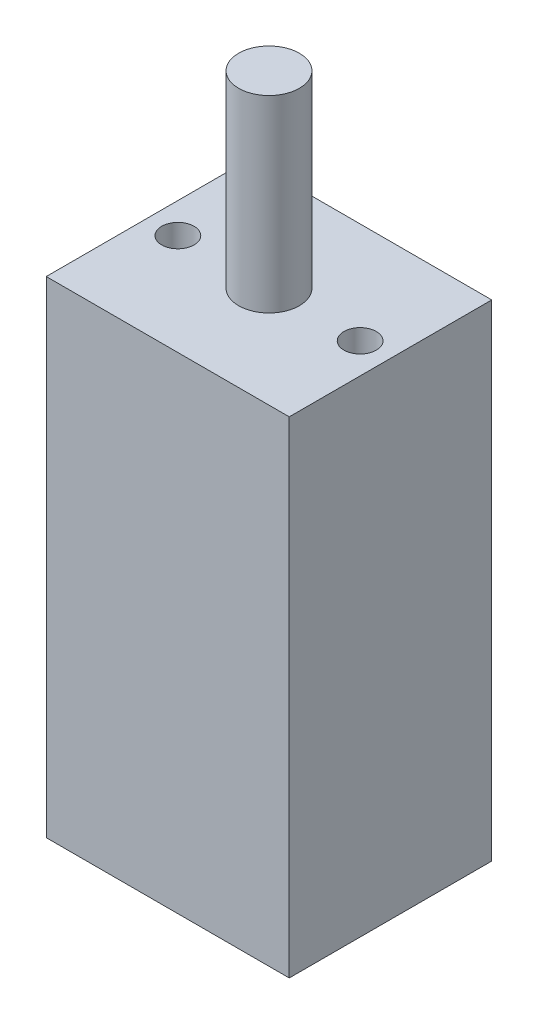
ISO-10303-21;
HEADER;
FILE_DESCRIPTION(('STEP AP214'),'2;1');
FILE_NAME('part.step','',(''),(''),'','','');
FILE_SCHEMA(('AUTOMOTIVE_DESIGN { 1 0 10303 214 1 1 1 1 }'));
ENDSEC;
DATA;
#1=APPLICATION_CONTEXT('core data for automotive mechanical design processes');
#2=APPLICATION_PROTOCOL_DEFINITION('international standard','automotive_design',2000,#1);
#3=PRODUCT_CONTEXT('',#1,'mechanical');
#4=PRODUCT('Part','Part','',(#3));
#5=PRODUCT_RELATED_PRODUCT_CATEGORY('part','',(#4));
#6=PRODUCT_DEFINITION_FORMATION('','',#4);
#7=PRODUCT_DEFINITION_CONTEXT('part definition',#1,'design');
#8=PRODUCT_DEFINITION('design','',#6,#7);
#9=PRODUCT_DEFINITION_SHAPE('','',#8);
#10=(LENGTH_UNIT() NAMED_UNIT(*) SI_UNIT(.MILLI.,.METRE.));
#11=(NAMED_UNIT(*) PLANE_ANGLE_UNIT() SI_UNIT($,.RADIAN.));
#12=(NAMED_UNIT(*) SI_UNIT($,.STERADIAN.) SOLID_ANGLE_UNIT());
#13=UNCERTAINTY_MEASURE_WITH_UNIT(LENGTH_MEASURE(1.E-05),#10,'distance_accuracy_value','');
#14=(GEOMETRIC_REPRESENTATION_CONTEXT(3) GLOBAL_UNCERTAINTY_ASSIGNED_CONTEXT((#13)) GLOBAL_UNIT_ASSIGNED_CONTEXT((#10,
#11,#12)) REPRESENTATION_CONTEXT('',''));
#15=CARTESIAN_POINT('',(0.,0.,0.));
#16=DIRECTION('',(0.,0.,1.));
#17=DIRECTION('',(1.,0.,0.));
#18=AXIS2_PLACEMENT_3D('',#15,#16,#17);
#19=CARTESIAN_POINT('',(0.,24.,0.));
#20=DIRECTION('',(0.,-1.,0.));
#21=DIRECTION('',(0.,0.,-1.));
#22=AXIS2_PLACEMENT_3D('',#19,#20,#21);
#23=PLANE('',#22);
#24=CARTESIAN_POINT('',(0.,24.,0.));
#25=DIRECTION('',(0.,-1.,0.));
#26=DIRECTION('',(0.,0.,-1.));
#27=AXIS2_PLACEMENT_3D('',#24,#25,#26);
#28=CIRCLE('',#27,1.5);
#29=CARTESIAN_POINT('',(0.,24.,-1.5));
#30=VERTEX_POINT('',#29);
#31=EDGE_CURVE('E11',#30,#30,#28,.F.);
#32=ORIENTED_EDGE('',*,*,#31,.F.);
#33=EDGE_LOOP('',(#32));
#34=FACE_BOUND('',#33,.T.);
#35=DIRECTION('',(0.,0.,-1.));
#36=VECTOR('',#35,1.);
#37=CARTESIAN_POINT('',(6.,24.,5.));
#38=LINE('',#37,#36);
#39=CARTESIAN_POINT('',(6.,24.,5.));
#40=VERTEX_POINT('',#39);
#41=CARTESIAN_POINT('',(6.,24.,-5.));
#42=VERTEX_POINT('',#41);
#43=EDGE_CURVE('E92',#40,#42,#38,.T.);
#44=ORIENTED_EDGE('',*,*,#43,.T.);
#45=DIRECTION('',(-1.,0.,0.));
#46=VECTOR('',#45,1.);
#47=CARTESIAN_POINT('',(-6.,24.,-5.));
#48=LINE('',#47,#46);
#49=CARTESIAN_POINT('',(-6.,24.,-5.));
#50=VERTEX_POINT('',#49);
#51=EDGE_CURVE('E87',#42,#50,#48,.T.);
#52=ORIENTED_EDGE('',*,*,#51,.T.);
#53=DIRECTION('',(0.,0.,1.));
#54=VECTOR('',#53,1.);
#55=CARTESIAN_POINT('',(-6.,24.,5.));
#56=LINE('',#55,#54);
#57=CARTESIAN_POINT('',(-6.,24.,5.));
#58=VERTEX_POINT('',#57);
#59=EDGE_CURVE('E95',#50,#58,#56,.T.);
#60=ORIENTED_EDGE('',*,*,#59,.T.);
#61=DIRECTION('',(1.,0.,0.));
#62=VECTOR('',#61,1.);
#63=CARTESIAN_POINT('',(-6.,24.,5.));
#64=LINE('',#63,#62);
#65=EDGE_CURVE('E59',#58,#40,#64,.T.);
#66=ORIENTED_EDGE('',*,*,#65,.T.);
#67=EDGE_LOOP('',(#44,#52,#60,#66));
#68=FACE_BOUND('',#67,.T.);
#69=CARTESIAN_POINT('',(4.5,24.,0.));
#70=DIRECTION('',(0.,1.,0.));
#71=DIRECTION('',(0.,0.,1.));
#72=AXIS2_PLACEMENT_3D('',#69,#70,#71);
#73=CIRCLE('',#72,0.800000000000001);
#74=CARTESIAN_POINT('',(4.5,24.,0.799999999999999));
#75=VERTEX_POINT('',#74);
#76=EDGE_CURVE('E112',#75,#75,#73,.T.);
#77=ORIENTED_EDGE('',*,*,#76,.F.);
#78=EDGE_LOOP('',(#77));
#79=FACE_BOUND('',#78,.T.);
#80=CARTESIAN_POINT('',(-4.5,24.,0.));
#81=DIRECTION('',(0.,1.,0.));
#82=DIRECTION('',(0.,0.,1.));
#83=AXIS2_PLACEMENT_3D('',#80,#81,#82);
#84=CIRCLE('',#83,0.8);
#85=CARTESIAN_POINT('',(-4.5,24.,0.8));
#86=VERTEX_POINT('',#85);
#87=EDGE_CURVE('E126',#86,#86,#84,.T.);
#88=ORIENTED_EDGE('',*,*,#87,.F.);
#89=EDGE_LOOP('',(#88));
#90=FACE_BOUND('',#89,.T.);
#91=ADVANCED_FACE('F41',(#34,#68,#79,#90),#23,.F.);
#92=CARTESIAN_POINT('',(0.,0.,0.));
#93=DIRECTION('',(0.,-1.,0.));
#94=DIRECTION('',(0.,0.,-1.));
#95=AXIS2_PLACEMENT_3D('',#92,#93,#94);
#96=PLANE('',#95);
#97=CARTESIAN_POINT('',(4.5,0.,0.));
#98=DIRECTION('',(0.,1.,0.));
#99=DIRECTION('',(0.,0.,1.));
#100=AXIS2_PLACEMENT_3D('',#97,#98,#99);
#101=CIRCLE('',#100,0.800000000000001);
#102=CARTESIAN_POINT('',(4.5,0.,0.799999999999999));
#103=VERTEX_POINT('',#102);
#104=EDGE_CURVE('E135',#103,#103,#101,.T.);
#105=ORIENTED_EDGE('',*,*,#104,.T.);
#106=EDGE_LOOP('',(#105));
#107=FACE_BOUND('',#106,.T.);
#108=DIRECTION('',(0.,0.,-1.));
#109=VECTOR('',#108,1.);
#110=CARTESIAN_POINT('',(6.,0.,5.));
#111=LINE('',#110,#109);
#112=CARTESIAN_POINT('',(6.,0.,5.));
#113=VERTEX_POINT('',#112);
#114=CARTESIAN_POINT('',(6.,0.,-5.));
#115=VERTEX_POINT('',#114);
#116=EDGE_CURVE('E106',#113,#115,#111,.T.);
#117=ORIENTED_EDGE('',*,*,#116,.F.);
#118=DIRECTION('',(1.,0.,0.));
#119=VECTOR('',#118,1.);
#120=CARTESIAN_POINT('',(-6.,0.,5.));
#121=LINE('',#120,#119);
#122=CARTESIAN_POINT('',(-6.,0.,5.));
#123=VERTEX_POINT('',#122);
#124=EDGE_CURVE('E83',#123,#113,#121,.T.);
#125=ORIENTED_EDGE('',*,*,#124,.F.);
#126=DIRECTION('',(0.,0.,1.));
#127=VECTOR('',#126,1.);
#128=CARTESIAN_POINT('',(-6.,0.,5.));
#129=LINE('',#128,#127);
#130=CARTESIAN_POINT('',(-6.,0.,-5.));
#131=VERTEX_POINT('',#130);
#132=EDGE_CURVE('E74',#131,#123,#129,.T.);
#133=ORIENTED_EDGE('',*,*,#132,.F.);
#134=DIRECTION('',(-1.,0.,0.));
#135=VECTOR('',#134,1.);
#136=CARTESIAN_POINT('',(-6.,0.,-5.));
#137=LINE('',#136,#135);
#138=EDGE_CURVE('E98',#115,#131,#137,.T.);
#139=ORIENTED_EDGE('',*,*,#138,.F.);
#140=EDGE_LOOP('',(#117,#125,#133,#139));
#141=FACE_BOUND('',#140,.T.);
#142=CARTESIAN_POINT('',(-4.5,0.,0.));
#143=DIRECTION('',(0.,1.,0.));
#144=DIRECTION('',(0.,0.,1.));
#145=AXIS2_PLACEMENT_3D('',#142,#143,#144);
#146=CIRCLE('',#145,0.8);
#147=CARTESIAN_POINT('',(-4.5,0.,0.8));
#148=VERTEX_POINT('',#147);
#149=EDGE_CURVE('E128',#148,#148,#146,.T.);
#150=ORIENTED_EDGE('',*,*,#149,.T.);
#151=EDGE_LOOP('',(#150));
#152=FACE_BOUND('',#151,.T.);
#153=ADVANCED_FACE('F117',(#107,#141,#152),#96,.T.);
#154=CARTESIAN_POINT('',(6.,24.,5.));
#155=DIRECTION('',(-1.,0.,0.));
#156=DIRECTION('',(0.,0.,1.));
#157=AXIS2_PLACEMENT_3D('',#154,#155,#156);
#158=PLANE('',#157);
#159=ORIENTED_EDGE('',*,*,#116,.T.);
#160=DIRECTION('',(0.,-1.,0.));
#161=VECTOR('',#160,1.);
#162=CARTESIAN_POINT('',(6.,24.,-5.));
#163=LINE('',#162,#161);
#164=EDGE_CURVE('E49',#42,#115,#163,.T.);
#165=ORIENTED_EDGE('',*,*,#164,.F.);
#166=ORIENTED_EDGE('',*,*,#43,.F.);
#167=DIRECTION('',(0.,-1.,0.));
#168=VECTOR('',#167,1.);
#169=CARTESIAN_POINT('',(6.,24.,5.));
#170=LINE('',#169,#168);
#171=EDGE_CURVE('E101',#40,#113,#170,.T.);
#172=ORIENTED_EDGE('',*,*,#171,.T.);
#173=EDGE_LOOP('',(#159,#165,#166,#172));
#174=FACE_BOUND('',#173,.T.);
#175=ADVANCED_FACE('F43',(#174),#158,.F.);
#176=CARTESIAN_POINT('',(-6.,24.,-5.));
#177=DIRECTION('',(0.,0.,1.));
#178=DIRECTION('',(1.,0.,0.));
#179=AXIS2_PLACEMENT_3D('',#176,#177,#178);
#180=PLANE('',#179);
#181=ORIENTED_EDGE('',*,*,#138,.T.);
#182=DIRECTION('',(0.,-1.,0.));
#183=VECTOR('',#182,1.);
#184=CARTESIAN_POINT('',(-6.,24.,-5.));
#185=LINE('',#184,#183);
#186=EDGE_CURVE('E100',#50,#131,#185,.T.);
#187=ORIENTED_EDGE('',*,*,#186,.F.);
#188=ORIENTED_EDGE('',*,*,#51,.F.);
#189=ORIENTED_EDGE('',*,*,#164,.T.);
#190=EDGE_LOOP('',(#181,#187,#188,#189));
#191=FACE_BOUND('',#190,.T.);
#192=ADVANCED_FACE('F97',(#191),#180,.F.);
#193=CARTESIAN_POINT('',(-6.,24.,5.));
#194=DIRECTION('',(1.,0.,0.));
#195=DIRECTION('',(0.,0.,-1.));
#196=AXIS2_PLACEMENT_3D('',#193,#194,#195);
#197=PLANE('',#196);
#198=ORIENTED_EDGE('',*,*,#132,.T.);
#199=DIRECTION('',(0.,-1.,0.));
#200=VECTOR('',#199,1.);
#201=CARTESIAN_POINT('',(-6.,24.,5.));
#202=LINE('',#201,#200);
#203=EDGE_CURVE('E99',#58,#123,#202,.T.);
#204=ORIENTED_EDGE('',*,*,#203,.F.);
#205=ORIENTED_EDGE('',*,*,#59,.F.);
#206=ORIENTED_EDGE('',*,*,#186,.T.);
#207=EDGE_LOOP('',(#198,#204,#205,#206));
#208=FACE_BOUND('',#207,.T.);
#209=ADVANCED_FACE('F105',(#208),#197,.F.);
#210=CARTESIAN_POINT('',(-6.,24.,5.));
#211=DIRECTION('',(0.,0.,-1.));
#212=DIRECTION('',(-1.,0.,0.));
#213=AXIS2_PLACEMENT_3D('',#210,#211,#212);
#214=PLANE('',#213);
#215=ORIENTED_EDGE('',*,*,#124,.T.);
#216=ORIENTED_EDGE('',*,*,#171,.F.);
#217=ORIENTED_EDGE('',*,*,#65,.F.);
#218=ORIENTED_EDGE('',*,*,#203,.T.);
#219=EDGE_LOOP('',(#215,#216,#217,#218));
#220=FACE_BOUND('',#219,.T.);
#221=ADVANCED_FACE('F144',(#220),#214,.F.);
#222=CARTESIAN_POINT('',(4.5,24.,0.));
#223=DIRECTION('',(0.,-1.,0.));
#224=DIRECTION('',(0.,0.,-1.));
#225=AXIS2_PLACEMENT_3D('',#222,#223,#224);
#226=CYLINDRICAL_SURFACE('',#225,0.800000000000001);
#227=ORIENTED_EDGE('',*,*,#76,.T.);
#228=EDGE_LOOP('',(#227));
#229=FACE_BOUND('',#228,.T.);
#230=ORIENTED_EDGE('',*,*,#104,.F.);
#231=EDGE_LOOP('',(#230));
#232=FACE_BOUND('',#231,.T.);
#233=ADVANCED_FACE('F145',(#229,#232),#226,.F.);
#234=CARTESIAN_POINT('',(-4.5,24.,0.));
#235=DIRECTION('',(0.,-1.,0.));
#236=DIRECTION('',(0.,0.,-1.));
#237=AXIS2_PLACEMENT_3D('',#234,#235,#236);
#238=CYLINDRICAL_SURFACE('',#237,0.8);
#239=ORIENTED_EDGE('',*,*,#87,.T.);
#240=EDGE_LOOP('',(#239));
#241=FACE_BOUND('',#240,.T.);
#242=ORIENTED_EDGE('',*,*,#149,.F.);
#243=EDGE_LOOP('',(#242));
#244=FACE_BOUND('',#243,.T.);
#245=ADVANCED_FACE('F143',(#241,#244),#238,.F.);
#246=CARTESIAN_POINT('',(0.,33.3,0.));
#247=DIRECTION('',(0.,-1.,0.));
#248=DIRECTION('',(0.,0.,-1.));
#249=AXIS2_PLACEMENT_3D('',#246,#247,#248);
#250=CYLINDRICAL_SURFACE('',#249,1.5);
#251=CARTESIAN_POINT('',(0.,33.3,0.));
#252=DIRECTION('',(0.,1.,0.));
#253=DIRECTION('',(0.,0.,1.));
#254=AXIS2_PLACEMENT_3D('',#251,#252,#253);
#255=CIRCLE('',#254,1.5);
#256=CARTESIAN_POINT('',(0.,33.3,1.5));
#257=VERTEX_POINT('',#256);
#258=EDGE_CURVE('E129',#257,#257,#255,.T.);
#259=ORIENTED_EDGE('',*,*,#258,.F.);
#260=EDGE_LOOP('',(#259));
#261=FACE_BOUND('',#260,.T.);
#262=ORIENTED_EDGE('',*,*,#31,.T.);
#263=EDGE_LOOP('',(#262));
#264=FACE_BOUND('',#263,.T.);
#265=ADVANCED_FACE('F155',(#261,#264),#250,.T.);
#266=CARTESIAN_POINT('',(0.,33.3,0.));
#267=DIRECTION('',(0.,1.,0.));
#268=DIRECTION('',(0.,0.,1.));
#269=AXIS2_PLACEMENT_3D('',#266,#267,#268);
#270=PLANE('',#269);
#271=ORIENTED_EDGE('',*,*,#258,.T.);
#272=EDGE_LOOP('',(#271));
#273=FACE_BOUND('',#272,.T.);
#274=ADVANCED_FACE('F212',(#273),#270,.T.);
#275=CLOSED_SHELL('',(#91,#153,#175,#192,#209,#221,#233,#245,#265,#274));
#276=MANIFOLD_SOLID_BREP('B2',#275);
#277=ADVANCED_BREP_SHAPE_REPRESENTATION('',(#18,#276),#14);
#278=SHAPE_DEFINITION_REPRESENTATION(#9,#277);
ENDSEC;
END-ISO-10303-21;
